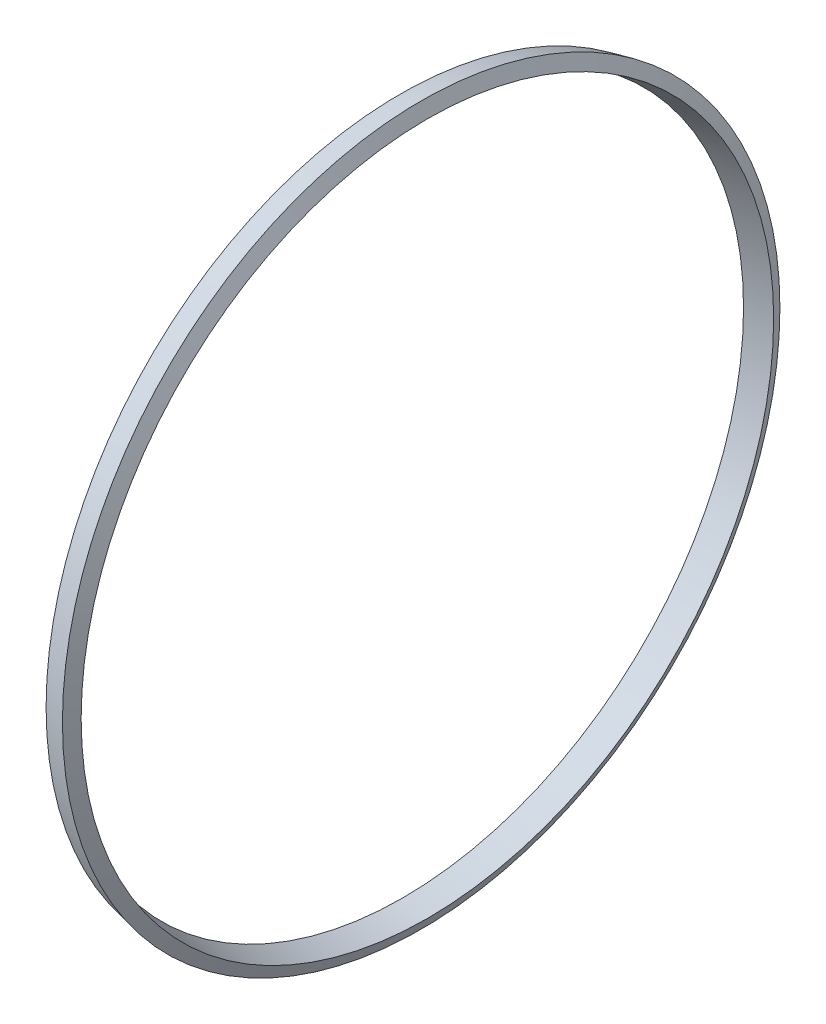
ISO-10303-21;
HEADER;
FILE_DESCRIPTION(('STEP AP214'),'2;1');
FILE_NAME('part.step','',(''),(''),'','','');
FILE_SCHEMA(('AUTOMOTIVE_DESIGN { 1 0 10303 214 1 1 1 1 }'));
ENDSEC;
DATA;
#1=APPLICATION_CONTEXT('core data for automotive mechanical design processes');
#2=APPLICATION_PROTOCOL_DEFINITION('international standard','automotive_design',2000,#1);
#3=PRODUCT_CONTEXT('',#1,'mechanical');
#4=PRODUCT('Part','Part','',(#3));
#5=PRODUCT_RELATED_PRODUCT_CATEGORY('part','',(#4));
#6=PRODUCT_DEFINITION_FORMATION('','',#4);
#7=PRODUCT_DEFINITION_CONTEXT('part definition',#1,'design');
#8=PRODUCT_DEFINITION('design','',#6,#7);
#9=PRODUCT_DEFINITION_SHAPE('','',#8);
#10=(LENGTH_UNIT() NAMED_UNIT(*) SI_UNIT(.MILLI.,.METRE.));
#11=(NAMED_UNIT(*) PLANE_ANGLE_UNIT() SI_UNIT($,.RADIAN.));
#12=(NAMED_UNIT(*) SI_UNIT($,.STERADIAN.) SOLID_ANGLE_UNIT());
#13=UNCERTAINTY_MEASURE_WITH_UNIT(LENGTH_MEASURE(1.E-05),#10,'distance_accuracy_value','');
#14=(GEOMETRIC_REPRESENTATION_CONTEXT(3) GLOBAL_UNCERTAINTY_ASSIGNED_CONTEXT((#13)) GLOBAL_UNIT_ASSIGNED_CONTEXT((#10,
#11,#12)) REPRESENTATION_CONTEXT('',''));
#15=CARTESIAN_POINT('',(0.,0.,0.));
#16=DIRECTION('',(0.,0.,1.));
#17=DIRECTION('',(1.,0.,0.));
#18=AXIS2_PLACEMENT_3D('',#15,#16,#17);
#19=CARTESIAN_POINT('',(15.7417927065699,4.44089209850063E-13,1.11022302462516E-13));
#20=DIRECTION('',(1.,0.,0.));
#21=DIRECTION('',(0.,0.,-1.));
#22=AXIS2_PLACEMENT_3D('',#19,#20,#21);
#23=CONICAL_SURFACE('',#22,27.744660926374,0.219062058543166);
#24=CARTESIAN_POINT('',(15.7417927065699,4.44089209850063E-13,1.11022302462516E-13));
#25=DIRECTION('',(-1.,0.,0.));
#26=DIRECTION('',(0.,0.,1.));
#27=AXIS2_PLACEMENT_3D('',#24,#25,#26);
#28=CIRCLE('',#27,27.744660926374);
#29=CARTESIAN_POINT('',(15.7417927065699,4.22527276890448E-13,27.7446609263741));
#30=VERTEX_POINT('',#29);
#31=EDGE_CURVE('E18',#30,#30,#28,.F.);
#32=ORIENTED_EDGE('',*,*,#31,.F.);
#33=EDGE_LOOP('',(#32));
#34=FACE_BOUND('',#33,.T.);
#35=CARTESIAN_POINT('',(14.1172380353141,2.22044604925031E-13,-5.55111512312578E-13));
#36=DIRECTION('',(-1.,0.,0.));
#37=DIRECTION('',(0.,0.,1.));
#38=AXIS2_PLACEMENT_3D('',#35,#36,#37);
#39=CIRCLE('',#38,27.382978548165);
#40=CARTESIAN_POINT('',(14.117238035314,2.00763755638139E-13,27.3829785481645));
#41=VERTEX_POINT('',#40);
#42=EDGE_CURVE('E27',#41,#41,#39,.F.);
#43=ORIENTED_EDGE('',*,*,#42,.T.);
#44=EDGE_LOOP('',(#43));
#45=FACE_BOUND('',#44,.T.);
#46=ADVANCED_FACE('F15',(#34,#45),#23,.T.);
#47=CARTESIAN_POINT('',(15.7417927065699,4.44089209850063E-13,1.11022302462516E-13));
#48=DIRECTION('',(-1.,0.,0.));
#49=DIRECTION('',(0.,0.,1.));
#50=AXIS2_PLACEMENT_3D('',#47,#48,#49);
#51=CONICAL_SURFACE('',#50,27.744660926374,1.1076645805292);
#52=CARTESIAN_POINT('',(16.2245,4.44089209850063E-13,1.11022302462516E-13));
#53=DIRECTION('',(1.,0.,0.));
#54=DIRECTION('',(0.,0.,-1.));
#55=AXIS2_PLACEMENT_3D('',#52,#53,#54);
#56=CIRCLE('',#55,26.778);
#57=CARTESIAN_POINT('',(16.2245,4.67872851572793E-13,-26.7779999999999));
#58=VERTEX_POINT('',#57);
#59=EDGE_CURVE('E22',#58,#58,#56,.F.);
#60=ORIENTED_EDGE('',*,*,#59,.T.);
#61=EDGE_LOOP('',(#60));
#62=FACE_BOUND('',#61,.T.);
#63=ORIENTED_EDGE('',*,*,#31,.T.);
#64=EDGE_LOOP('',(#63));
#65=FACE_BOUND('',#64,.T.);
#66=ADVANCED_FACE('F35',(#62,#65),#51,.T.);
#67=CARTESIAN_POINT('',(14.1172380353141,2.22044604925031E-13,-5.55111512312578E-13));
#68=DIRECTION('',(-1.,0.,0.));
#69=DIRECTION('',(0.,-1.,0.));
#70=AXIS2_PLACEMENT_3D('',#67,#68,#69);
#71=CONICAL_SURFACE('',#70,27.382978548165,1.37408342973019);
#72=CARTESIAN_POINT('',(14.323080723711,0.,0.));
#73=DIRECTION('',(1.,0.,0.));
#74=DIRECTION('',(0.,0.,-1.));
#75=AXIS2_PLACEMENT_3D('',#72,#73,#74);
#76=CIRCLE('',#75,26.350099042467);
#77=CARTESIAN_POINT('',(14.323080723711,0.,-26.350099042467));
#78=VERTEX_POINT('',#77);
#79=EDGE_CURVE('E10',#78,#78,#76,.T.);
#80=ORIENTED_EDGE('',*,*,#79,.T.);
#81=EDGE_LOOP('',(#80));
#82=FACE_BOUND('',#81,.T.);
#83=ORIENTED_EDGE('',*,*,#42,.F.);
#84=EDGE_LOOP('',(#83));
#85=FACE_BOUND('',#84,.T.);
#86=ADVANCED_FACE('F42',(#82,#85),#71,.F.);
#87=CARTESIAN_POINT('',(16.2245,4.44089209850063E-13,1.11022302462516E-13));
#88=DIRECTION('',(1.,0.,0.));
#89=DIRECTION('',(0.,0.,-1.));
#90=AXIS2_PLACEMENT_3D('',#87,#88,#89);
#91=CONICAL_SURFACE('',#90,26.778,0.221355299579027);
#92=ORIENTED_EDGE('',*,*,#59,.F.);
#93=EDGE_LOOP('',(#92));
#94=FACE_BOUND('',#93,.T.);
#95=ORIENTED_EDGE('',*,*,#79,.F.);
#96=EDGE_LOOP('',(#95));
#97=FACE_BOUND('',#96,.T.);
#98=ADVANCED_FACE('F44',(#94,#97),#91,.F.);
#99=CLOSED_SHELL('',(#46,#66,#86,#98));
#100=MANIFOLD_SOLID_BREP('B1',#99);
#101=ADVANCED_BREP_SHAPE_REPRESENTATION('',(#18,#100),#14);
#102=SHAPE_DEFINITION_REPRESENTATION(#9,#101);
ENDSEC;
END-ISO-10303-21;
